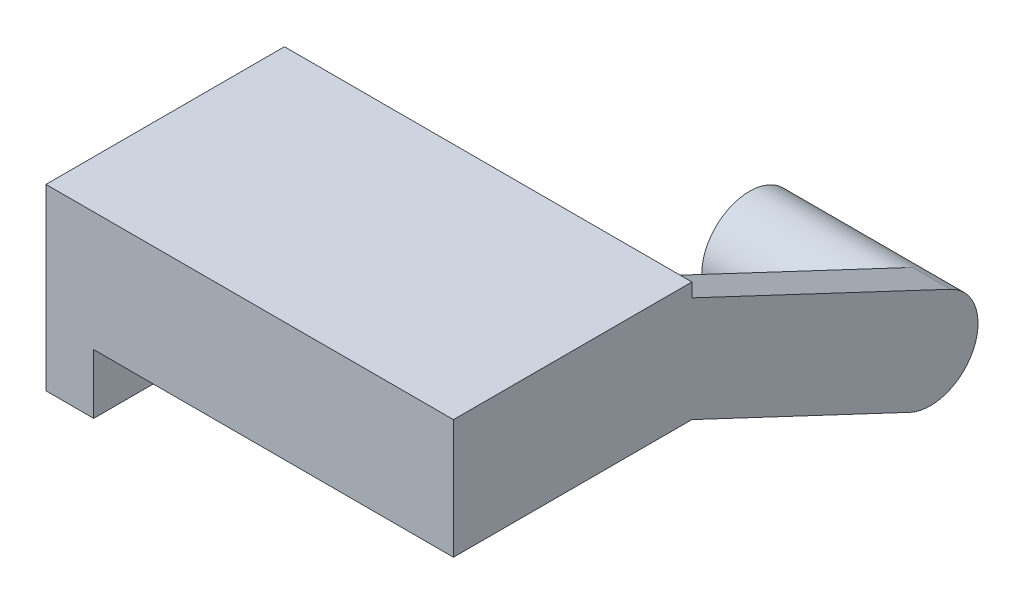
ISO-10303-21;
HEADER;
FILE_DESCRIPTION(('STEP AP214'),'2;1');
FILE_NAME('part.step','',(''),(''),'','','');
FILE_SCHEMA(('AUTOMOTIVE_DESIGN { 1 0 10303 214 1 1 1 1 }'));
ENDSEC;
DATA;
#1=APPLICATION_CONTEXT('core data for automotive mechanical design processes');
#2=APPLICATION_PROTOCOL_DEFINITION('international standard','automotive_design',2000,#1);
#3=PRODUCT_CONTEXT('',#1,'mechanical');
#4=PRODUCT('Part','Part','',(#3));
#5=PRODUCT_RELATED_PRODUCT_CATEGORY('part','',(#4));
#6=PRODUCT_DEFINITION_FORMATION('','',#4);
#7=PRODUCT_DEFINITION_CONTEXT('part definition',#1,'design');
#8=PRODUCT_DEFINITION('design','',#6,#7);
#9=PRODUCT_DEFINITION_SHAPE('','',#8);
#10=(LENGTH_UNIT() NAMED_UNIT(*) SI_UNIT(.MILLI.,.METRE.));
#11=(NAMED_UNIT(*) PLANE_ANGLE_UNIT() SI_UNIT($,.RADIAN.));
#12=(NAMED_UNIT(*) SI_UNIT($,.STERADIAN.) SOLID_ANGLE_UNIT());
#13=UNCERTAINTY_MEASURE_WITH_UNIT(LENGTH_MEASURE(1.E-05),#10,'distance_accuracy_value','');
#14=(GEOMETRIC_REPRESENTATION_CONTEXT(3) GLOBAL_UNCERTAINTY_ASSIGNED_CONTEXT((#13)) GLOBAL_UNIT_ASSIGNED_CONTEXT((#10,
#11,#12)) REPRESENTATION_CONTEXT('',''));
#15=CARTESIAN_POINT('',(0.,0.,0.));
#16=DIRECTION('',(0.,0.,1.));
#17=DIRECTION('',(1.,0.,0.));
#18=AXIS2_PLACEMENT_3D('',#15,#16,#17);
#19=CARTESIAN_POINT('',(31.,0.,0.));
#20=DIRECTION('',(1.,0.,0.));
#21=DIRECTION('',(0.,0.,-1.));
#22=AXIS2_PLACEMENT_3D('',#19,#20,#21);
#23=PLANE('',#22);
#24=CARTESIAN_POINT('',(31.,-7.5,-30.));
#25=DIRECTION('',(-1.,0.,0.));
#26=DIRECTION('',(0.,0.,1.));
#27=AXIS2_PLACEMENT_3D('',#24,#25,#26);
#28=CIRCLE('',#27,4.);
#29=CARTESIAN_POINT('',(31.,-11.1185879371589,-28.2953530157103));
#30=VERTEX_POINT('',#29);
#31=CARTESIAN_POINT('',(31.,-3.8814120628411,-31.7046469842897));
#32=VERTEX_POINT('',#31);
#33=EDGE_CURVE('E130',#30,#32,#28,.T.);
#34=ORIENTED_EDGE('',*,*,#33,.F.);
#35=DIRECTION('',(0.,-0.426161746072432,-0.904646984289727));
#36=VECTOR('',#35,1.);
#37=CARTESIAN_POINT('',(31.,1.80929396857945,-0.852323492144864));
#38=LINE('',#37,#36);
#39=CARTESIAN_POINT('',(31.,-2.5,-10.));
#40=VERTEX_POINT('',#39);
#41=EDGE_CURVE('E132',#40,#30,#38,.T.);
#42=ORIENTED_EDGE('',*,*,#41,.F.);
#43=DIRECTION('',(0.,1.,0.));
#44=VECTOR('',#43,1.);
#45=CARTESIAN_POINT('',(31.,7.5,-10.));
#46=LINE('',#45,#44);
#47=CARTESIAN_POINT('',(31.,6.34322850673195,-10.));
#48=VERTEX_POINT('',#47);
#49=EDGE_CURVE('E61',#40,#48,#46,.T.);
#50=ORIENTED_EDGE('',*,*,#49,.T.);
#51=DIRECTION('',(0.,0.426161746072431,0.904646984289727));
#52=VECTOR('',#51,1.);
#53=CARTESIAN_POINT('',(31.,9.04646984289726,-4.26161746072431));
#54=LINE('',#53,#52);
#55=EDGE_CURVE('E134',#32,#48,#54,.T.);
#56=ORIENTED_EDGE('',*,*,#55,.F.);
#57=EDGE_LOOP('',(#34,#42,#50,#56));
#58=FACE_BOUND('',#57,.T.);
#59=ADVANCED_FACE('F45',(#58),#23,.F.);
#60=CARTESIAN_POINT('',(4.,0.,0.));
#61=DIRECTION('',(-1.,0.,0.));
#62=DIRECTION('',(0.,0.,1.));
#63=AXIS2_PLACEMENT_3D('',#60,#61,#62);
#64=PLANE('',#63);
#65=CARTESIAN_POINT('',(4.,-5.,-5.));
#66=DIRECTION('',(1.,0.,0.));
#67=DIRECTION('',(0.,0.,-1.));
#68=AXIS2_PLACEMENT_3D('',#65,#66,#67);
#69=CIRCLE('',#68,1.35);
#70=CARTESIAN_POINT('',(4.,-5.,-6.35));
#71=VERTEX_POINT('',#70);
#72=EDGE_CURVE('E176',#71,#71,#69,.T.);
#73=ORIENTED_EDGE('',*,*,#72,.F.);
#74=EDGE_LOOP('',(#73));
#75=FACE_BOUND('',#74,.T.);
#76=CARTESIAN_POINT('',(4.,-5.,5.));
#77=DIRECTION('',(1.,0.,0.));
#78=DIRECTION('',(0.,0.,-1.));
#79=AXIS2_PLACEMENT_3D('',#76,#77,#78);
#80=CIRCLE('',#79,1.35);
#81=CARTESIAN_POINT('',(4.,-5.,3.65));
#82=VERTEX_POINT('',#81);
#83=EDGE_CURVE('E184',#82,#82,#80,.T.);
#84=ORIENTED_EDGE('',*,*,#83,.F.);
#85=EDGE_LOOP('',(#84));
#86=FACE_BOUND('',#85,.T.);
#87=DIRECTION('',(0.,0.,-1.));
#88=VECTOR('',#87,1.);
#89=CARTESIAN_POINT('',(4.,-2.5,10.));
#90=LINE('',#89,#88);
#91=CARTESIAN_POINT('',(4.,-2.5,10.));
#92=VERTEX_POINT('',#91);
#93=CARTESIAN_POINT('',(4.,-2.5,-10.));
#94=VERTEX_POINT('',#93);
#95=EDGE_CURVE('E72',#92,#94,#90,.T.);
#96=ORIENTED_EDGE('',*,*,#95,.F.);
#97=DIRECTION('',(0.,-1.,0.));
#98=VECTOR('',#97,1.);
#99=CARTESIAN_POINT('',(4.,-7.5,10.));
#100=LINE('',#99,#98);
#101=CARTESIAN_POINT('',(4.,-7.5,10.));
#102=VERTEX_POINT('',#101);
#103=EDGE_CURVE('E195',#92,#102,#100,.T.);
#104=ORIENTED_EDGE('',*,*,#103,.T.);
#105=DIRECTION('',(0.,0.,-1.));
#106=VECTOR('',#105,1.);
#107=CARTESIAN_POINT('',(4.,-7.5,10.));
#108=LINE('',#107,#106);
#109=CARTESIAN_POINT('',(4.,-7.5,-10.));
#110=VERTEX_POINT('',#109);
#111=EDGE_CURVE('E199',#102,#110,#108,.T.);
#112=ORIENTED_EDGE('',*,*,#111,.T.);
#113=DIRECTION('',(0.,1.,0.));
#114=VECTOR('',#113,1.);
#115=CARTESIAN_POINT('',(4.,-7.5,-10.));
#116=LINE('',#115,#114);
#117=EDGE_CURVE('E192',#110,#94,#116,.T.);
#118=ORIENTED_EDGE('',*,*,#117,.T.);
#119=EDGE_LOOP('',(#96,#104,#112,#118));
#120=FACE_BOUND('',#119,.T.);
#121=ADVANCED_FACE('F242',(#75,#86,#120),#64,.F.);
#122=CARTESIAN_POINT('',(0.,0.,0.));
#123=DIRECTION('',(-1.,0.,0.));
#124=DIRECTION('',(0.,0.,1.));
#125=AXIS2_PLACEMENT_3D('',#122,#123,#124);
#126=PLANE('',#125);
#127=CARTESIAN_POINT('',(0.,-5.,5.));
#128=DIRECTION('',(1.,0.,0.));
#129=DIRECTION('',(0.,0.,-1.));
#130=AXIS2_PLACEMENT_3D('',#127,#128,#129);
#131=CIRCLE('',#130,1.35);
#132=CARTESIAN_POINT('',(0.,-5.,3.65));
#133=VERTEX_POINT('',#132);
#134=EDGE_CURVE('E180',#133,#133,#131,.T.);
#135=ORIENTED_EDGE('',*,*,#134,.T.);
#136=EDGE_LOOP('',(#135));
#137=FACE_BOUND('',#136,.T.);
#138=DIRECTION('',(0.,1.,0.));
#139=VECTOR('',#138,1.);
#140=CARTESIAN_POINT('',(0.,-7.5,-10.));
#141=LINE('',#140,#139);
#142=CARTESIAN_POINT('',(0.,-7.5,-10.));
#143=VERTEX_POINT('',#142);
#144=CARTESIAN_POINT('',(0.,7.5,-10.));
#145=VERTEX_POINT('',#144);
#146=EDGE_CURVE('E188',#143,#145,#141,.T.);
#147=ORIENTED_EDGE('',*,*,#146,.F.);
#148=DIRECTION('',(0.,0.,-1.));
#149=VECTOR('',#148,1.);
#150=CARTESIAN_POINT('',(0.,-7.5,10.));
#151=LINE('',#150,#149);
#152=CARTESIAN_POINT('',(0.,-7.5,10.));
#153=VERTEX_POINT('',#152);
#154=EDGE_CURVE('E196',#153,#143,#151,.T.);
#155=ORIENTED_EDGE('',*,*,#154,.F.);
#156=DIRECTION('',(0.,-1.,0.));
#157=VECTOR('',#156,1.);
#158=CARTESIAN_POINT('',(0.,-7.5,10.));
#159=LINE('',#158,#157);
#160=CARTESIAN_POINT('',(0.,7.5,10.));
#161=VERTEX_POINT('',#160);
#162=EDGE_CURVE('E209',#161,#153,#159,.T.);
#163=ORIENTED_EDGE('',*,*,#162,.F.);
#164=DIRECTION('',(0.,0.,1.));
#165=VECTOR('',#164,1.);
#166=CARTESIAN_POINT('',(0.,7.5,10.));
#167=LINE('',#166,#165);
#168=EDGE_CURVE('E206',#145,#161,#167,.T.);
#169=ORIENTED_EDGE('',*,*,#168,.F.);
#170=EDGE_LOOP('',(#147,#155,#163,#169));
#171=FACE_BOUND('',#170,.T.);
#172=CARTESIAN_POINT('',(0.,-5.,-5.));
#173=DIRECTION('',(1.,0.,0.));
#174=DIRECTION('',(0.,0.,-1.));
#175=AXIS2_PLACEMENT_3D('',#172,#173,#174);
#176=CIRCLE('',#175,1.35);
#177=CARTESIAN_POINT('',(0.,-5.,-6.35));
#178=VERTEX_POINT('',#177);
#179=EDGE_CURVE('E175',#178,#178,#176,.T.);
#180=ORIENTED_EDGE('',*,*,#179,.T.);
#181=EDGE_LOOP('',(#180));
#182=FACE_BOUND('',#181,.T.);
#183=ADVANCED_FACE('F234',(#137,#171,#182),#126,.T.);
#184=CARTESIAN_POINT('',(4.,-7.5,-10.));
#185=DIRECTION('',(0.,0.,1.));
#186=DIRECTION('',(1.,0.,0.));
#187=AXIS2_PLACEMENT_3D('',#184,#185,#186);
#188=PLANE('',#187);
#189=ORIENTED_EDGE('',*,*,#146,.T.);
#190=DIRECTION('',(-1.,0.,0.));
#191=VECTOR('',#190,1.);
#192=CARTESIAN_POINT('',(4.,7.5,-10.));
#193=LINE('',#192,#191);
#194=CARTESIAN_POINT('',(34.175,7.5,-10.));
#195=VERTEX_POINT('',#194);
#196=EDGE_CURVE('E11',#195,#145,#193,.T.);
#197=ORIENTED_EDGE('',*,*,#196,.F.);
#198=DIRECTION('',(0.,1.,0.));
#199=VECTOR('',#198,1.);
#200=CARTESIAN_POINT('',(34.175,0.,-10.));
#201=LINE('',#200,#199);
#202=CARTESIAN_POINT('',(34.175,6.34322850673195,-10.));
#203=VERTEX_POINT('',#202);
#204=EDGE_CURVE('E254',#203,#195,#201,.T.);
#205=ORIENTED_EDGE('',*,*,#204,.F.);
#206=DIRECTION('',(-1.,0.,0.));
#207=VECTOR('',#206,1.);
#208=CARTESIAN_POINT('',(34.175,6.34322850673195,-10.));
#209=LINE('',#208,#207);
#210=EDGE_CURVE('E160',#203,#48,#209,.T.);
#211=ORIENTED_EDGE('',*,*,#210,.T.);
#212=ORIENTED_EDGE('',*,*,#49,.F.);
#213=DIRECTION('',(-1.,0.,0.));
#214=VECTOR('',#213,1.);
#215=CARTESIAN_POINT('',(31.,-2.5,-10.));
#216=LINE('',#215,#214);
#217=EDGE_CURVE('E165',#40,#94,#216,.T.);
#218=ORIENTED_EDGE('',*,*,#217,.T.);
#219=ORIENTED_EDGE('',*,*,#117,.F.);
#220=DIRECTION('',(-1.,0.,0.));
#221=VECTOR('',#220,1.);
#222=CARTESIAN_POINT('',(4.,-7.5,-10.));
#223=LINE('',#222,#221);
#224=EDGE_CURVE('E202',#110,#143,#223,.T.);
#225=ORIENTED_EDGE('',*,*,#224,.T.);
#226=EDGE_LOOP('',(#189,#197,#205,#211,#212,#218,#219,#225));
#227=FACE_BOUND('',#226,.T.);
#228=ADVANCED_FACE('F47',(#227),#188,.F.);
#229=CARTESIAN_POINT('',(4.,7.5,10.));
#230=DIRECTION('',(0.,-1.,0.));
#231=DIRECTION('',(0.,0.,-1.));
#232=AXIS2_PLACEMENT_3D('',#229,#230,#231);
#233=PLANE('',#232);
#234=ORIENTED_EDGE('',*,*,#168,.T.);
#235=DIRECTION('',(-1.,0.,0.));
#236=VECTOR('',#235,1.);
#237=CARTESIAN_POINT('',(4.,7.5,10.));
#238=LINE('',#237,#236);
#239=CARTESIAN_POINT('',(34.175,7.5,10.));
#240=VERTEX_POINT('',#239);
#241=EDGE_CURVE('E54',#240,#161,#238,.T.);
#242=ORIENTED_EDGE('',*,*,#241,.F.);
#243=DIRECTION('',(0.,0.,1.));
#244=VECTOR('',#243,1.);
#245=CARTESIAN_POINT('',(34.175,7.5,0.));
#246=LINE('',#245,#244);
#247=EDGE_CURVE('E251',#195,#240,#246,.T.);
#248=ORIENTED_EDGE('',*,*,#247,.F.);
#249=ORIENTED_EDGE('',*,*,#196,.T.);
#250=EDGE_LOOP('',(#234,#242,#248,#249));
#251=FACE_BOUND('',#250,.T.);
#252=ADVANCED_FACE('F272',(#251),#233,.F.);
#253=CARTESIAN_POINT('',(4.,-7.5,10.));
#254=DIRECTION('',(0.,0.,-1.));
#255=DIRECTION('',(-1.,0.,0.));
#256=AXIS2_PLACEMENT_3D('',#253,#254,#255);
#257=PLANE('',#256);
#258=ORIENTED_EDGE('',*,*,#162,.T.);
#259=DIRECTION('',(-1.,0.,0.));
#260=VECTOR('',#259,1.);
#261=CARTESIAN_POINT('',(4.,-7.5,10.));
#262=LINE('',#261,#260);
#263=EDGE_CURVE('E217',#102,#153,#262,.T.);
#264=ORIENTED_EDGE('',*,*,#263,.F.);
#265=ORIENTED_EDGE('',*,*,#103,.F.);
#266=DIRECTION('',(-1.,0.,0.));
#267=VECTOR('',#266,1.);
#268=CARTESIAN_POINT('',(31.,-2.5,10.));
#269=LINE('',#268,#267);
#270=CARTESIAN_POINT('',(34.175,-2.5,10.));
#271=VERTEX_POINT('',#270);
#272=EDGE_CURVE('E171',#271,#92,#269,.T.);
#273=ORIENTED_EDGE('',*,*,#272,.F.);
#274=DIRECTION('',(0.,-1.,0.));
#275=VECTOR('',#274,1.);
#276=CARTESIAN_POINT('',(34.175,0.,10.));
#277=LINE('',#276,#275);
#278=EDGE_CURVE('E227',#240,#271,#277,.T.);
#279=ORIENTED_EDGE('',*,*,#278,.F.);
#280=ORIENTED_EDGE('',*,*,#241,.T.);
#281=EDGE_LOOP('',(#258,#264,#265,#273,#279,#280));
#282=FACE_BOUND('',#281,.T.);
#283=ADVANCED_FACE('F224',(#282),#257,.F.);
#284=CARTESIAN_POINT('',(4.,-7.5,10.));
#285=DIRECTION('',(0.,1.,0.));
#286=DIRECTION('',(0.,0.,1.));
#287=AXIS2_PLACEMENT_3D('',#284,#285,#286);
#288=PLANE('',#287);
#289=ORIENTED_EDGE('',*,*,#154,.T.);
#290=ORIENTED_EDGE('',*,*,#224,.F.);
#291=ORIENTED_EDGE('',*,*,#111,.F.);
#292=ORIENTED_EDGE('',*,*,#263,.T.);
#293=EDGE_LOOP('',(#289,#290,#291,#292));
#294=FACE_BOUND('',#293,.T.);
#295=ADVANCED_FACE('F238',(#294),#288,.F.);
#296=CARTESIAN_POINT('',(4.,-5.,5.));
#297=DIRECTION('',(-1.,0.,0.));
#298=DIRECTION('',(0.,0.,1.));
#299=AXIS2_PLACEMENT_3D('',#296,#297,#298);
#300=CYLINDRICAL_SURFACE('',#299,1.35);
#301=ORIENTED_EDGE('',*,*,#83,.T.);
#302=EDGE_LOOP('',(#301));
#303=FACE_BOUND('',#302,.T.);
#304=ORIENTED_EDGE('',*,*,#134,.F.);
#305=EDGE_LOOP('',(#304));
#306=FACE_BOUND('',#305,.T.);
#307=ADVANCED_FACE('F301',(#303,#306),#300,.F.);
#308=CARTESIAN_POINT('',(4.,-5.,-5.));
#309=DIRECTION('',(-1.,0.,0.));
#310=DIRECTION('',(0.,0.,1.));
#311=AXIS2_PLACEMENT_3D('',#308,#309,#310);
#312=CYLINDRICAL_SURFACE('',#311,1.35);
#313=ORIENTED_EDGE('',*,*,#72,.T.);
#314=EDGE_LOOP('',(#313));
#315=FACE_BOUND('',#314,.T.);
#316=ORIENTED_EDGE('',*,*,#179,.F.);
#317=EDGE_LOOP('',(#316));
#318=FACE_BOUND('',#317,.T.);
#319=ADVANCED_FACE('F298',(#315,#318),#312,.F.);
#320=CARTESIAN_POINT('',(31.,-2.5,10.));
#321=DIRECTION('',(0.,1.,0.));
#322=DIRECTION('',(0.,0.,1.));
#323=AXIS2_PLACEMENT_3D('',#320,#321,#322);
#324=PLANE('',#323);
#325=ORIENTED_EDGE('',*,*,#95,.T.);
#326=ORIENTED_EDGE('',*,*,#217,.F.);
#327=DIRECTION('',(-1.,0.,0.));
#328=VECTOR('',#327,1.);
#329=CARTESIAN_POINT('',(34.175,-2.5,-10.));
#330=LINE('',#329,#328);
#331=CARTESIAN_POINT('',(34.175,-2.5,-10.));
#332=VERTEX_POINT('',#331);
#333=EDGE_CURVE('E148',#332,#40,#330,.T.);
#334=ORIENTED_EDGE('',*,*,#333,.F.);
#335=DIRECTION('',(0.,0.,-1.));
#336=VECTOR('',#335,1.);
#337=CARTESIAN_POINT('',(34.175,-2.5,0.));
#338=LINE('',#337,#336);
#339=EDGE_CURVE('E247',#271,#332,#338,.T.);
#340=ORIENTED_EDGE('',*,*,#339,.F.);
#341=ORIENTED_EDGE('',*,*,#272,.T.);
#342=EDGE_LOOP('',(#325,#326,#334,#340,#341));
#343=FACE_BOUND('',#342,.T.);
#344=ADVANCED_FACE('F244',(#343),#324,.F.);
#345=CARTESIAN_POINT('',(34.175,1.80929396857945,-0.852323492144864));
#346=DIRECTION('',(0.,0.904646984289726,-0.426161746072431));
#347=DIRECTION('',(0.,0.426161746072432,0.904646984289727));
#348=AXIS2_PLACEMENT_3D('',#345,#346,#347);
#349=PLANE('',#348);
#350=ORIENTED_EDGE('',*,*,#41,.T.);
#351=DIRECTION('',(-1.,0.,0.));
#352=VECTOR('',#351,1.);
#353=CARTESIAN_POINT('',(34.175,-11.1185879371589,-28.2953530157103));
#354=LINE('',#353,#352);
#355=CARTESIAN_POINT('',(34.175,-11.1185879371589,-28.2953530157103));
#356=VERTEX_POINT('',#355);
#357=EDGE_CURVE('E145',#356,#30,#354,.T.);
#358=ORIENTED_EDGE('',*,*,#357,.F.);
#359=DIRECTION('',(0.,-0.426161746072432,-0.904646984289727));
#360=VECTOR('',#359,1.);
#361=CARTESIAN_POINT('',(34.175,1.80929396857945,-0.852323492144864));
#362=LINE('',#361,#360);
#363=EDGE_CURVE('E261',#332,#356,#362,.T.);
#364=ORIENTED_EDGE('',*,*,#363,.F.);
#365=ORIENTED_EDGE('',*,*,#333,.T.);
#366=EDGE_LOOP('',(#350,#358,#364,#365));
#367=FACE_BOUND('',#366,.T.);
#368=ADVANCED_FACE('F144',(#367),#349,.F.);
#369=CARTESIAN_POINT('',(34.175,-7.5,-30.));
#370=DIRECTION('',(-1.,0.,0.));
#371=DIRECTION('',(0.,0.,1.));
#372=AXIS2_PLACEMENT_3D('',#369,#370,#371);
#373=CYLINDRICAL_SURFACE('',#372,3.99999999999999);
#374=ORIENTED_EDGE('',*,*,#357,.T.);
#375=ORIENTED_EDGE('',*,*,#33,.T.);
#376=DIRECTION('',(-1.,0.,0.));
#377=VECTOR('',#376,1.);
#378=CARTESIAN_POINT('',(34.175,-3.8814120628411,-31.7046469842897));
#379=LINE('',#378,#377);
#380=CARTESIAN_POINT('',(34.175,-3.8814120628411,-31.7046469842897));
#381=VERTEX_POINT('',#380);
#382=EDGE_CURVE('E155',#381,#32,#379,.T.);
#383=ORIENTED_EDGE('',*,*,#382,.F.);
#384=CARTESIAN_POINT('',(34.175,-7.5,-30.));
#385=DIRECTION('',(1.,0.,0.));
#386=DIRECTION('',(0.,0.,-1.));
#387=AXIS2_PLACEMENT_3D('',#384,#385,#386);
#388=CIRCLE('',#387,3.99999999999999);
#389=EDGE_CURVE('E153',#356,#381,#388,.T.);
#390=ORIENTED_EDGE('',*,*,#389,.F.);
#391=EDGE_LOOP('',(#374,#375,#383,#390));
#392=FACE_BOUND('',#391,.T.);
#393=CARTESIAN_POINT('',(19.,-7.5,-30.));
#394=DIRECTION('',(-1.,0.,0.));
#395=DIRECTION('',(0.,0.,1.));
#396=AXIS2_PLACEMENT_3D('',#393,#394,#395);
#397=CIRCLE('',#396,4.);
#398=CARTESIAN_POINT('',(19.,-7.5,-26.));
#399=VERTEX_POINT('',#398);
#400=EDGE_CURVE('E140',#399,#399,#397,.T.);
#401=ORIENTED_EDGE('',*,*,#400,.F.);
#402=EDGE_LOOP('',(#401));
#403=FACE_BOUND('',#402,.T.);
#404=ADVANCED_FACE('F151',(#392,#403),#373,.T.);
#405=CARTESIAN_POINT('',(34.175,9.04646984289726,-4.26161746072431));
#406=DIRECTION('',(0.,-0.904646984289726,0.426161746072431));
#407=DIRECTION('',(0.,-0.426161746072431,-0.904646984289727));
#408=AXIS2_PLACEMENT_3D('',#405,#406,#407);
#409=PLANE('',#408);
#410=ORIENTED_EDGE('',*,*,#55,.T.);
#411=ORIENTED_EDGE('',*,*,#210,.F.);
#412=DIRECTION('',(0.,0.426161746072431,0.904646984289727));
#413=VECTOR('',#412,1.);
#414=CARTESIAN_POINT('',(34.175,9.04646984289726,-4.26161746072431));
#415=LINE('',#414,#413);
#416=EDGE_CURVE('E268',#381,#203,#415,.T.);
#417=ORIENTED_EDGE('',*,*,#416,.F.);
#418=ORIENTED_EDGE('',*,*,#382,.T.);
#419=EDGE_LOOP('',(#410,#411,#417,#418));
#420=FACE_BOUND('',#419,.T.);
#421=ADVANCED_FACE('F289',(#420),#409,.F.);
#422=CARTESIAN_POINT('',(34.175,0.,0.));
#423=DIRECTION('',(1.,0.,0.));
#424=DIRECTION('',(0.,0.,-1.));
#425=AXIS2_PLACEMENT_3D('',#422,#423,#424);
#426=PLANE('',#425);
#427=ORIENTED_EDGE('',*,*,#339,.T.);
#428=ORIENTED_EDGE('',*,*,#363,.T.);
#429=ORIENTED_EDGE('',*,*,#389,.T.);
#430=ORIENTED_EDGE('',*,*,#416,.T.);
#431=ORIENTED_EDGE('',*,*,#204,.T.);
#432=ORIENTED_EDGE('',*,*,#247,.T.);
#433=ORIENTED_EDGE('',*,*,#278,.T.);
#434=EDGE_LOOP('',(#427,#428,#429,#430,#431,#432,#433));
#435=FACE_BOUND('',#434,.T.);
#436=ADVANCED_FACE('F249',(#435),#426,.T.);
#437=CARTESIAN_POINT('',(19.,-7.5,-30.));
#438=DIRECTION('',(-1.,0.,0.));
#439=DIRECTION('',(0.,0.,1.));
#440=AXIS2_PLACEMENT_3D('',#437,#438,#439);
#441=PLANE('',#440);
#442=ORIENTED_EDGE('',*,*,#400,.T.);
#443=EDGE_LOOP('',(#442));
#444=FACE_BOUND('',#443,.T.);
#445=ADVANCED_FACE('F346',(#444),#441,.T.);
#446=CLOSED_SHELL('',(#59,#121,#183,#228,#252,#283,#295,#307,#319,#344,#368,#404,#421,#436,#445));
#447=MANIFOLD_SOLID_BREP('B2',#446);
#448=ADVANCED_BREP_SHAPE_REPRESENTATION('',(#18,#447),#14);
#449=SHAPE_DEFINITION_REPRESENTATION(#9,#448);
ENDSEC;
END-ISO-10303-21;
